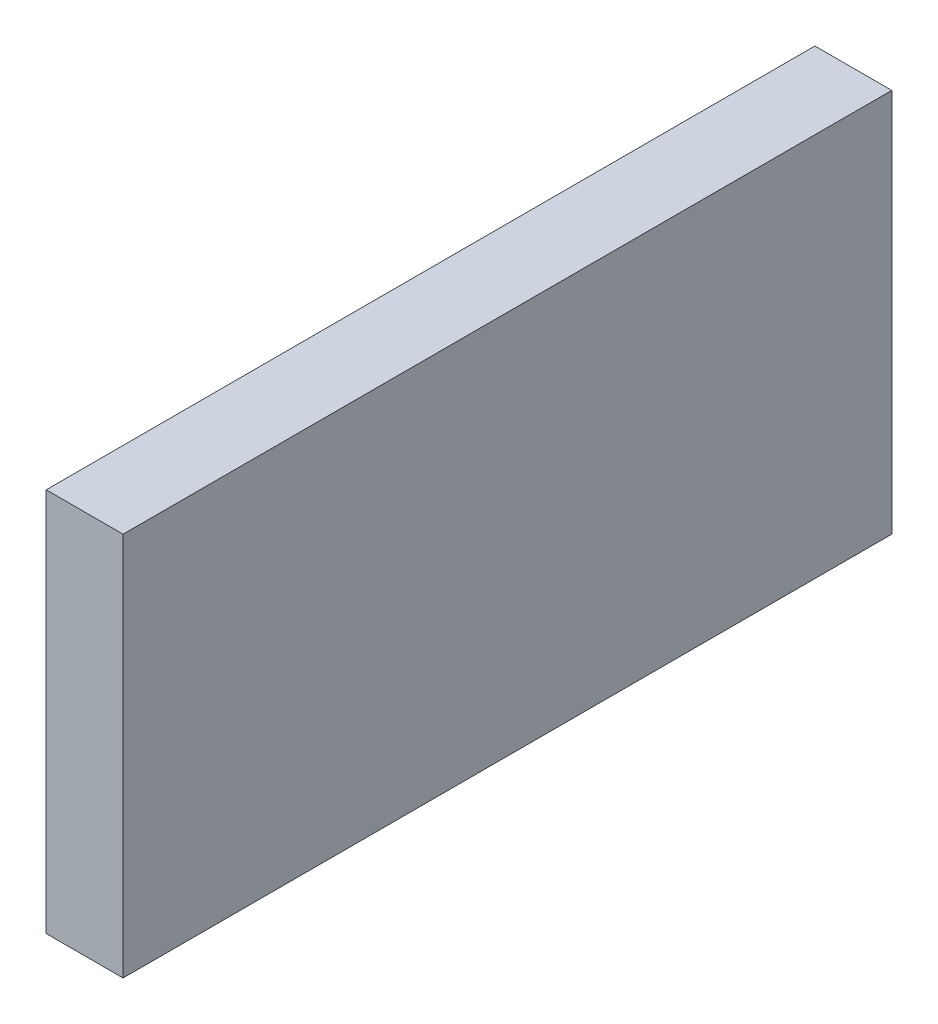
ISO-10303-21;
HEADER;
FILE_DESCRIPTION(('STEP AP214'),'2;1');
FILE_NAME('part.step','',(''),(''),'','','');
FILE_SCHEMA(('AUTOMOTIVE_DESIGN { 1 0 10303 214 1 1 1 1 }'));
ENDSEC;
DATA;
#1=APPLICATION_CONTEXT('core data for automotive mechanical design processes');
#2=APPLICATION_PROTOCOL_DEFINITION('international standard','automotive_design',2000,#1);
#3=PRODUCT_CONTEXT('',#1,'mechanical');
#4=PRODUCT('Part','Part','',(#3));
#5=PRODUCT_RELATED_PRODUCT_CATEGORY('part','',(#4));
#6=PRODUCT_DEFINITION_FORMATION('','',#4);
#7=PRODUCT_DEFINITION_CONTEXT('part definition',#1,'design');
#8=PRODUCT_DEFINITION('design','',#6,#7);
#9=PRODUCT_DEFINITION_SHAPE('','',#8);
#10=(LENGTH_UNIT() NAMED_UNIT(*) SI_UNIT(.MILLI.,.METRE.));
#11=(NAMED_UNIT(*) PLANE_ANGLE_UNIT() SI_UNIT($,.RADIAN.));
#12=(NAMED_UNIT(*) SI_UNIT($,.STERADIAN.) SOLID_ANGLE_UNIT());
#13=UNCERTAINTY_MEASURE_WITH_UNIT(LENGTH_MEASURE(1.E-05),#10,'distance_accuracy_value','');
#14=(GEOMETRIC_REPRESENTATION_CONTEXT(3) GLOBAL_UNCERTAINTY_ASSIGNED_CONTEXT((#13)) GLOBAL_UNIT_ASSIGNED_CONTEXT((#10,
#11,#12)) REPRESENTATION_CONTEXT('',''));
#15=CARTESIAN_POINT('',(0.,0.,0.));
#16=DIRECTION('',(0.,0.,1.));
#17=DIRECTION('',(1.,0.,0.));
#18=AXIS2_PLACEMENT_3D('',#15,#16,#17);
#19=CARTESIAN_POINT('',(-4.,0.,0.));
#20=DIRECTION('',(0.,0.,1.));
#21=DIRECTION('',(1.,0.,0.));
#22=AXIS2_PLACEMENT_3D('',#19,#20,#21);
#23=PLANE('',#22);
#24=DIRECTION('',(0.,-1.,0.));
#25=VECTOR('',#24,1.);
#26=CARTESIAN_POINT('',(0.,0.,0.));
#27=LINE('',#26,#25);
#28=CARTESIAN_POINT('',(0.,20.,0.));
#29=VERTEX_POINT('',#28);
#30=CARTESIAN_POINT('',(0.,0.,0.));
#31=VERTEX_POINT('',#30);
#32=EDGE_CURVE('E104',#29,#31,#27,.T.);
#33=ORIENTED_EDGE('',*,*,#32,.F.);
#34=DIRECTION('',(1.,0.,0.));
#35=VECTOR('',#34,1.);
#36=CARTESIAN_POINT('',(-4.,20.,0.));
#37=LINE('',#36,#35);
#38=CARTESIAN_POINT('',(-4.,20.,0.));
#39=VERTEX_POINT('',#38);
#40=EDGE_CURVE('E11',#39,#29,#37,.T.);
#41=ORIENTED_EDGE('',*,*,#40,.F.);
#42=DIRECTION('',(0.,-1.,0.));
#43=VECTOR('',#42,1.);
#44=CARTESIAN_POINT('',(-4.,0.,0.));
#45=LINE('',#44,#43);
#46=CARTESIAN_POINT('',(-4.,0.,0.));
#47=VERTEX_POINT('',#46);
#48=EDGE_CURVE('E100',#39,#47,#45,.T.);
#49=ORIENTED_EDGE('',*,*,#48,.T.);
#50=DIRECTION('',(1.,0.,0.));
#51=VECTOR('',#50,1.);
#52=CARTESIAN_POINT('',(-4.,0.,0.));
#53=LINE('',#52,#51);
#54=EDGE_CURVE('E45',#47,#31,#53,.T.);
#55=ORIENTED_EDGE('',*,*,#54,.T.);
#56=EDGE_LOOP('',(#33,#41,#49,#55));
#57=FACE_BOUND('',#56,.T.);
#58=ADVANCED_FACE('F39',(#57),#23,.T.);
#59=CARTESIAN_POINT('',(-4.,20.,0.));
#60=DIRECTION('',(0.,1.,0.));
#61=DIRECTION('',(0.,0.,1.));
#62=AXIS2_PLACEMENT_3D('',#59,#60,#61);
#63=PLANE('',#62);
#64=DIRECTION('',(0.,0.,1.));
#65=VECTOR('',#64,1.);
#66=CARTESIAN_POINT('',(0.,20.,0.));
#67=LINE('',#66,#65);
#68=CARTESIAN_POINT('',(0.,20.,-40.));
#69=VERTEX_POINT('',#68);
#70=EDGE_CURVE('E98',#69,#29,#67,.T.);
#71=ORIENTED_EDGE('',*,*,#70,.F.);
#72=DIRECTION('',(1.,0.,0.));
#73=VECTOR('',#72,1.);
#74=CARTESIAN_POINT('',(-4.,20.,-40.));
#75=LINE('',#74,#73);
#76=CARTESIAN_POINT('',(-4.,20.,-40.));
#77=VERTEX_POINT('',#76);
#78=EDGE_CURVE('E48',#77,#69,#75,.T.);
#79=ORIENTED_EDGE('',*,*,#78,.F.);
#80=DIRECTION('',(0.,0.,1.));
#81=VECTOR('',#80,1.);
#82=CARTESIAN_POINT('',(-4.,20.,0.));
#83=LINE('',#82,#81);
#84=EDGE_CURVE('E92',#77,#39,#83,.T.);
#85=ORIENTED_EDGE('',*,*,#84,.T.);
#86=ORIENTED_EDGE('',*,*,#40,.T.);
#87=EDGE_LOOP('',(#71,#79,#85,#86));
#88=FACE_BOUND('',#87,.T.);
#89=ADVANCED_FACE('F111',(#88),#63,.T.);
#90=CARTESIAN_POINT('',(-4.,0.,-40.));
#91=DIRECTION('',(0.,0.,-1.));
#92=DIRECTION('',(-1.,0.,0.));
#93=AXIS2_PLACEMENT_3D('',#90,#91,#92);
#94=PLANE('',#93);
#95=DIRECTION('',(0.,1.,0.));
#96=VECTOR('',#95,1.);
#97=CARTESIAN_POINT('',(0.,0.,-40.));
#98=LINE('',#97,#96);
#99=CARTESIAN_POINT('',(0.,0.,-40.));
#100=VERTEX_POINT('',#99);
#101=EDGE_CURVE('E87',#100,#69,#98,.T.);
#102=ORIENTED_EDGE('',*,*,#101,.F.);
#103=DIRECTION('',(1.,0.,0.));
#104=VECTOR('',#103,1.);
#105=CARTESIAN_POINT('',(-4.,0.,-40.));
#106=LINE('',#105,#104);
#107=CARTESIAN_POINT('',(-4.,0.,-40.));
#108=VERTEX_POINT('',#107);
#109=EDGE_CURVE('E84',#108,#100,#106,.T.);
#110=ORIENTED_EDGE('',*,*,#109,.F.);
#111=DIRECTION('',(0.,1.,0.));
#112=VECTOR('',#111,1.);
#113=CARTESIAN_POINT('',(-4.,0.,-40.));
#114=LINE('',#113,#112);
#115=EDGE_CURVE('E90',#108,#77,#114,.T.);
#116=ORIENTED_EDGE('',*,*,#115,.T.);
#117=ORIENTED_EDGE('',*,*,#78,.T.);
#118=EDGE_LOOP('',(#102,#110,#116,#117));
#119=FACE_BOUND('',#118,.T.);
#120=ADVANCED_FACE('F86',(#119),#94,.T.);
#121=CARTESIAN_POINT('',(-4.,0.,0.));
#122=DIRECTION('',(0.,-1.,0.));
#123=DIRECTION('',(0.,0.,-1.));
#124=AXIS2_PLACEMENT_3D('',#121,#122,#123);
#125=PLANE('',#124);
#126=DIRECTION('',(0.,0.,-1.));
#127=VECTOR('',#126,1.);
#128=CARTESIAN_POINT('',(0.,0.,0.));
#129=LINE('',#128,#127);
#130=EDGE_CURVE('E106',#31,#100,#129,.T.);
#131=ORIENTED_EDGE('',*,*,#130,.F.);
#132=ORIENTED_EDGE('',*,*,#54,.F.);
#133=DIRECTION('',(0.,0.,-1.));
#134=VECTOR('',#133,1.);
#135=CARTESIAN_POINT('',(-4.,0.,0.));
#136=LINE('',#135,#134);
#137=EDGE_CURVE('E93',#47,#108,#136,.T.);
#138=ORIENTED_EDGE('',*,*,#137,.T.);
#139=ORIENTED_EDGE('',*,*,#109,.T.);
#140=EDGE_LOOP('',(#131,#132,#138,#139));
#141=FACE_BOUND('',#140,.T.);
#142=ADVANCED_FACE('F96',(#141),#125,.T.);
#143=CARTESIAN_POINT('',(-4.,0.,0.));
#144=DIRECTION('',(-1.,0.,0.));
#145=DIRECTION('',(0.,0.,1.));
#146=AXIS2_PLACEMENT_3D('',#143,#144,#145);
#147=PLANE('',#146);
#148=ORIENTED_EDGE('',*,*,#48,.F.);
#149=ORIENTED_EDGE('',*,*,#84,.F.);
#150=ORIENTED_EDGE('',*,*,#115,.F.);
#151=ORIENTED_EDGE('',*,*,#137,.F.);
#152=EDGE_LOOP('',(#148,#149,#150,#151));
#153=FACE_BOUND('',#152,.T.);
#154=ADVANCED_FACE('F95',(#153),#147,.T.);
#155=CARTESIAN_POINT('',(0.,0.,0.));
#156=DIRECTION('',(-1.,0.,0.));
#157=DIRECTION('',(0.,0.,1.));
#158=AXIS2_PLACEMENT_3D('',#155,#156,#157);
#159=PLANE('',#158);
#160=ORIENTED_EDGE('',*,*,#32,.T.);
#161=ORIENTED_EDGE('',*,*,#130,.T.);
#162=ORIENTED_EDGE('',*,*,#101,.T.);
#163=ORIENTED_EDGE('',*,*,#70,.T.);
#164=EDGE_LOOP('',(#160,#161,#162,#163));
#165=FACE_BOUND('',#164,.T.);
#166=ADVANCED_FACE('F115',(#165),#159,.F.);
#167=CLOSED_SHELL('',(#58,#89,#120,#142,#154,#166));
#168=MANIFOLD_SOLID_BREP('B2',#167);
#169=ADVANCED_BREP_SHAPE_REPRESENTATION('',(#18,#168),#14);
#170=SHAPE_DEFINITION_REPRESENTATION(#9,#169);
ENDSEC;
END-ISO-10303-21;
